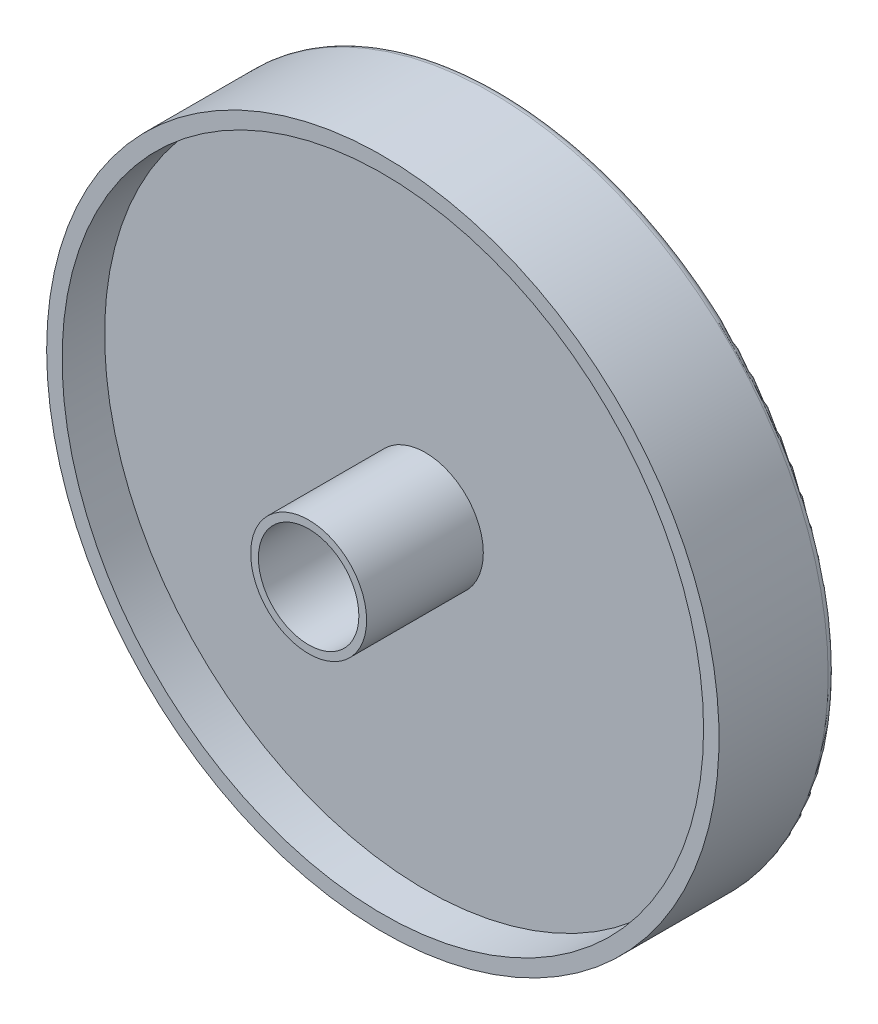
ISO-10303-21;
HEADER;
FILE_DESCRIPTION(('STEP AP214'),'2;1');
FILE_NAME('part.step','',(''),(''),'','','');
FILE_SCHEMA(('AUTOMOTIVE_DESIGN { 1 0 10303 214 1 1 1 1 }'));
ENDSEC;
DATA;
#1=APPLICATION_CONTEXT('core data for automotive mechanical design processes');
#2=APPLICATION_PROTOCOL_DEFINITION('international standard','automotive_design',2000,#1);
#3=PRODUCT_CONTEXT('',#1,'mechanical');
#4=PRODUCT('Part','Part','',(#3));
#5=PRODUCT_RELATED_PRODUCT_CATEGORY('part','',(#4));
#6=PRODUCT_DEFINITION_FORMATION('','',#4);
#7=PRODUCT_DEFINITION_CONTEXT('part definition',#1,'design');
#8=PRODUCT_DEFINITION('design','',#6,#7);
#9=PRODUCT_DEFINITION_SHAPE('','',#8);
#10=(LENGTH_UNIT() NAMED_UNIT(*) SI_UNIT(.MILLI.,.METRE.));
#11=(NAMED_UNIT(*) PLANE_ANGLE_UNIT() SI_UNIT($,.RADIAN.));
#12=(NAMED_UNIT(*) SI_UNIT($,.STERADIAN.) SOLID_ANGLE_UNIT());
#13=UNCERTAINTY_MEASURE_WITH_UNIT(LENGTH_MEASURE(1.E-05),#10,'distance_accuracy_value','');
#14=(GEOMETRIC_REPRESENTATION_CONTEXT(3) GLOBAL_UNCERTAINTY_ASSIGNED_CONTEXT((#13)) GLOBAL_UNIT_ASSIGNED_CONTEXT((#10,
#11,#12)) REPRESENTATION_CONTEXT('',''));
#15=CARTESIAN_POINT('',(0.,0.,0.));
#16=DIRECTION('',(0.,0.,1.));
#17=DIRECTION('',(1.,0.,0.));
#18=AXIS2_PLACEMENT_3D('',#15,#16,#17);
#19=CARTESIAN_POINT('',(0.,0.,0.));
#20=DIRECTION('',(0.,0.,1.));
#21=DIRECTION('',(1.,0.,0.));
#22=AXIS2_PLACEMENT_3D('',#19,#20,#21);
#23=PLANE('',#22);
#24=CARTESIAN_POINT('',(0.,0.,0.));
#25=DIRECTION('',(0.,0.,1.));
#26=DIRECTION('',(1.,0.,0.));
#27=AXIS2_PLACEMENT_3D('',#24,#25,#26);
#28=CIRCLE('',#27,41.5);
#29=CARTESIAN_POINT('',(41.5,0.,0.));
#30=VERTEX_POINT('',#29);
#31=EDGE_CURVE('E55',#30,#30,#28,.T.);
#32=ORIENTED_EDGE('',*,*,#31,.F.);
#33=EDGE_LOOP('',(#32));
#34=FACE_BOUND('',#33,.T.);
#35=CARTESIAN_POINT('',(0.,0.,0.));
#36=DIRECTION('',(0.,0.,-1.));
#37=DIRECTION('',(-1.,0.,0.));
#38=AXIS2_PLACEMENT_3D('',#35,#36,#37);
#39=CIRCLE('',#38,43.5);
#40=CARTESIAN_POINT('',(-43.5,0.,0.));
#41=VERTEX_POINT('',#40);
#42=EDGE_CURVE('E52',#41,#41,#39,.T.);
#43=ORIENTED_EDGE('',*,*,#42,.F.);
#44=EDGE_LOOP('',(#43));
#45=FACE_BOUND('',#44,.T.);
#46=ADVANCED_FACE('F32',(#34,#45),#23,.T.);
#47=CARTESIAN_POINT('',(0.,0.,-18.));
#48=DIRECTION('',(0.,0.,-1.));
#49=DIRECTION('',(-1.,0.,0.));
#50=AXIS2_PLACEMENT_3D('',#47,#48,#49);
#51=CYLINDRICAL_SURFACE('',#50,43.5);
#52=CARTESIAN_POINT('',(0.,0.,-14.1195440220866));
#53=DIRECTION('',(0.,0.,1.));
#54=DIRECTION('',(1.,0.,0.));
#55=AXIS2_PLACEMENT_3D('',#52,#53,#54);
#56=CIRCLE('',#55,43.5);
#57=CARTESIAN_POINT('',(43.5,0.,-14.1195440220866));
#58=VERTEX_POINT('',#57);
#59=EDGE_CURVE('E10',#58,#58,#56,.T.);
#60=ORIENTED_EDGE('',*,*,#59,.T.);
#61=EDGE_LOOP('',(#60));
#62=FACE_BOUND('',#61,.T.);
#63=ORIENTED_EDGE('',*,*,#42,.T.);
#64=EDGE_LOOP('',(#63));
#65=FACE_BOUND('',#64,.T.);
#66=ADVANCED_FACE('F162',(#62,#65),#51,.T.);
#67=CARTESIAN_POINT('',(0.,0.,-18.));
#68=DIRECTION('',(0.,0.,1.));
#69=DIRECTION('',(1.,0.,0.));
#70=AXIS2_PLACEMENT_3D('',#67,#68,#69);
#71=CONICAL_SURFACE('',#70,20.,1.44382353718082);
#72=CARTESIAN_POINT('',(0.,0.,-17.9919497796038));
#73=DIRECTION('',(0.,0.,-1.));
#74=DIRECTION('',(-1.,0.,0.));
#75=AXIS2_PLACEMENT_3D('',#72,#73,#74);
#76=CIRCLE('',#75,20.0630600597699);
#77=CARTESIAN_POINT('',(-20.0630600597699,0.,-17.9919497796038));
#78=VERTEX_POINT('',#77);
#79=EDGE_CURVE('E39',#78,#78,#76,.F.);
#80=ORIENTED_EDGE('',*,*,#79,.T.);
#81=EDGE_LOOP('',(#80));
#82=FACE_BOUND('',#81,.T.);
#83=CARTESIAN_POINT('',(0.,0.,-15.1114938016905));
#84=DIRECTION('',(0.,0.,-1.));
#85=DIRECTION('',(-1.,0.,0.));
#86=AXIS2_PLACEMENT_3D('',#83,#84,#85);
#87=CIRCLE('',#86,42.6266318867579);
#88=CARTESIAN_POINT('',(-42.6266318867579,0.,-15.1114938016905));
#89=VERTEX_POINT('',#88);
#90=EDGE_CURVE('E43',#89,#89,#87,.T.);
#91=ORIENTED_EDGE('',*,*,#90,.T.);
#92=EDGE_LOOP('',(#91));
#93=FACE_BOUND('',#92,.T.);
#94=ADVANCED_FACE('F168',(#82,#93),#71,.T.);
#95=CARTESIAN_POINT('',(-20.,0.,-18.));
#96=DIRECTION('',(0.,0.,-1.));
#97=DIRECTION('',(-1.,0.,0.));
#98=AXIS2_PLACEMENT_3D('',#95,#96,#97);
#99=PLANE('',#98);
#100=CARTESIAN_POINT('',(0.,0.,-18.));
#101=DIRECTION('',(0.,0.,-1.));
#102=DIRECTION('',(-1.,0.,0.));
#103=AXIS2_PLACEMENT_3D('',#100,#101,#102);
#104=CIRCLE('',#103,19.9364281730119);
#105=CARTESIAN_POINT('',(-19.9364281730119,0.,-18.));
#106=VERTEX_POINT('',#105);
#107=EDGE_CURVE('E47',#106,#106,#104,.T.);
#108=ORIENTED_EDGE('',*,*,#107,.T.);
#109=EDGE_LOOP('',(#108));
#110=FACE_BOUND('',#109,.T.);
#111=CARTESIAN_POINT('',(12.3743686707646,12.3743686707646,-18.));
#112=DIRECTION('',(0.,0.,-1.));
#113=DIRECTION('',(-1.,0.,0.));
#114=AXIS2_PLACEMENT_3D('',#111,#112,#113);
#115=CIRCLE('',#114,1.24999999999999);
#116=CARTESIAN_POINT('',(11.1243686707646,12.3743686707646,-18.));
#117=VERTEX_POINT('',#116);
#118=EDGE_CURVE('E100',#117,#117,#115,.T.);
#119=ORIENTED_EDGE('',*,*,#118,.F.);
#120=EDGE_LOOP('',(#119));
#121=FACE_BOUND('',#120,.T.);
#122=CARTESIAN_POINT('',(0.,17.5,-18.));
#123=DIRECTION('',(0.,0.,-1.));
#124=DIRECTION('',(-1.,0.,0.));
#125=AXIS2_PLACEMENT_3D('',#122,#123,#124);
#126=CIRCLE('',#125,1.24999999999999);
#127=CARTESIAN_POINT('',(-1.24999999999999,17.5,-18.));
#128=VERTEX_POINT('',#127);
#129=EDGE_CURVE('E97',#128,#128,#126,.T.);
#130=ORIENTED_EDGE('',*,*,#129,.F.);
#131=EDGE_LOOP('',(#130));
#132=FACE_BOUND('',#131,.T.);
#133=CARTESIAN_POINT('',(-12.3743686707646,12.3743686707645,-18.));
#134=DIRECTION('',(0.,0.,-1.));
#135=DIRECTION('',(-1.,0.,0.));
#136=AXIS2_PLACEMENT_3D('',#133,#134,#135);
#137=CIRCLE('',#136,1.24999999999999);
#138=CARTESIAN_POINT('',(-13.6243686707646,12.3743686707645,-18.));
#139=VERTEX_POINT('',#138);
#140=EDGE_CURVE('E94',#139,#139,#137,.T.);
#141=ORIENTED_EDGE('',*,*,#140,.F.);
#142=EDGE_LOOP('',(#141));
#143=FACE_BOUND('',#142,.T.);
#144=CARTESIAN_POINT('',(-17.5,0.,-18.));
#145=DIRECTION('',(0.,0.,-1.));
#146=DIRECTION('',(-1.,0.,0.));
#147=AXIS2_PLACEMENT_3D('',#144,#145,#146);
#148=CIRCLE('',#147,1.24999999999999);
#149=CARTESIAN_POINT('',(-18.75,0.,-18.));
#150=VERTEX_POINT('',#149);
#151=EDGE_CURVE('E91',#150,#150,#148,.T.);
#152=ORIENTED_EDGE('',*,*,#151,.F.);
#153=EDGE_LOOP('',(#152));
#154=FACE_BOUND('',#153,.T.);
#155=CARTESIAN_POINT('',(-12.3743686707646,-12.3743686707646,-18.));
#156=DIRECTION('',(0.,0.,-1.));
#157=DIRECTION('',(-1.,0.,0.));
#158=AXIS2_PLACEMENT_3D('',#155,#156,#157);
#159=CIRCLE('',#158,1.24999999999999);
#160=CARTESIAN_POINT('',(-13.6243686707645,-12.3743686707646,-18.));
#161=VERTEX_POINT('',#160);
#162=EDGE_CURVE('E88',#161,#161,#159,.T.);
#163=ORIENTED_EDGE('',*,*,#162,.F.);
#164=EDGE_LOOP('',(#163));
#165=FACE_BOUND('',#164,.T.);
#166=CARTESIAN_POINT('',(0.,-17.5,-18.));
#167=DIRECTION('',(0.,0.,-1.));
#168=DIRECTION('',(-1.,0.,0.));
#169=AXIS2_PLACEMENT_3D('',#166,#167,#168);
#170=CIRCLE('',#169,1.24999999999999);
#171=CARTESIAN_POINT('',(-1.24999999999999,-17.5,-18.));
#172=VERTEX_POINT('',#171);
#173=EDGE_CURVE('E85',#172,#172,#170,.T.);
#174=ORIENTED_EDGE('',*,*,#173,.F.);
#175=EDGE_LOOP('',(#174));
#176=FACE_BOUND('',#175,.T.);
#177=CARTESIAN_POINT('',(12.3743686707646,-12.3743686707646,-18.));
#178=DIRECTION('',(0.,0.,-1.));
#179=DIRECTION('',(-1.,0.,0.));
#180=AXIS2_PLACEMENT_3D('',#177,#178,#179);
#181=CIRCLE('',#180,1.24999999999999);
#182=CARTESIAN_POINT('',(11.1243686707646,-12.3743686707646,-18.));
#183=VERTEX_POINT('',#182);
#184=EDGE_CURVE('E82',#183,#183,#181,.T.);
#185=ORIENTED_EDGE('',*,*,#184,.F.);
#186=EDGE_LOOP('',(#185));
#187=FACE_BOUND('',#186,.T.);
#188=CARTESIAN_POINT('',(17.5,0.,-18.));
#189=DIRECTION('',(0.,0.,-1.));
#190=DIRECTION('',(-1.,0.,0.));
#191=AXIS2_PLACEMENT_3D('',#188,#189,#190);
#192=CIRCLE('',#191,1.24999999999999);
#193=CARTESIAN_POINT('',(16.25,0.,-18.));
#194=VERTEX_POINT('',#193);
#195=EDGE_CURVE('E79',#194,#194,#192,.T.);
#196=ORIENTED_EDGE('',*,*,#195,.F.);
#197=EDGE_LOOP('',(#196));
#198=FACE_BOUND('',#197,.T.);
#199=CARTESIAN_POINT('',(12.5,0.,-18.));
#200=DIRECTION('',(0.,0.,-1.));
#201=DIRECTION('',(-1.,0.,0.));
#202=AXIS2_PLACEMENT_3D('',#199,#200,#201);
#203=CIRCLE('',#202,1.24999999999999);
#204=CARTESIAN_POINT('',(11.25,0.,-18.));
#205=VERTEX_POINT('',#204);
#206=EDGE_CURVE('E76',#205,#205,#203,.T.);
#207=ORIENTED_EDGE('',*,*,#206,.F.);
#208=EDGE_LOOP('',(#207));
#209=FACE_BOUND('',#208,.T.);
#210=CARTESIAN_POINT('',(0.,12.5,-18.));
#211=DIRECTION('',(0.,0.,-1.));
#212=DIRECTION('',(-1.,0.,0.));
#213=AXIS2_PLACEMENT_3D('',#210,#211,#212);
#214=CIRCLE('',#213,1.24999999999999);
#215=CARTESIAN_POINT('',(-1.24999999999999,12.5,-18.));
#216=VERTEX_POINT('',#215);
#217=EDGE_CURVE('E73',#216,#216,#214,.T.);
#218=ORIENTED_EDGE('',*,*,#217,.F.);
#219=EDGE_LOOP('',(#218));
#220=FACE_BOUND('',#219,.T.);
#221=CARTESIAN_POINT('',(-12.5,0.,-18.));
#222=DIRECTION('',(0.,0.,-1.));
#223=DIRECTION('',(-1.,0.,0.));
#224=AXIS2_PLACEMENT_3D('',#221,#222,#223);
#225=CIRCLE('',#224,1.24999999999999);
#226=CARTESIAN_POINT('',(-13.75,0.,-18.));
#227=VERTEX_POINT('',#226);
#228=EDGE_CURVE('E70',#227,#227,#225,.T.);
#229=ORIENTED_EDGE('',*,*,#228,.F.);
#230=EDGE_LOOP('',(#229));
#231=FACE_BOUND('',#230,.T.);
#232=CARTESIAN_POINT('',(0.,-12.5,-18.));
#233=DIRECTION('',(0.,0.,-1.));
#234=DIRECTION('',(-1.,0.,0.));
#235=AXIS2_PLACEMENT_3D('',#232,#233,#234);
#236=CIRCLE('',#235,1.24999999999999);
#237=CARTESIAN_POINT('',(-1.24999999999999,-12.5,-18.));
#238=VERTEX_POINT('',#237);
#239=EDGE_CURVE('E67',#238,#238,#236,.T.);
#240=ORIENTED_EDGE('',*,*,#239,.F.);
#241=EDGE_LOOP('',(#240));
#242=FACE_BOUND('',#241,.T.);
#243=CARTESIAN_POINT('',(0.,0.,-18.));
#244=DIRECTION('',(0.,0.,-1.));
#245=DIRECTION('',(-1.,0.,0.));
#246=AXIS2_PLACEMENT_3D('',#243,#244,#245);
#247=CIRCLE('',#246,6.5);
#248=CARTESIAN_POINT('',(-6.5,0.,-18.));
#249=VERTEX_POINT('',#248);
#250=EDGE_CURVE('E58',#249,#249,#247,.T.);
#251=ORIENTED_EDGE('',*,*,#250,.F.);
#252=EDGE_LOOP('',(#251));
#253=FACE_BOUND('',#252,.T.);
#254=ADVANCED_FACE('F188',(#110,#121,#132,#143,#154,#165,#176,#187,#198,#209,#220,#231,#242,
#253),#99,.T.);
#255=CARTESIAN_POINT('',(0.,0.,-13.));
#256=DIRECTION('',(0.,0.,1.));
#257=DIRECTION('',(1.,0.,0.));
#258=AXIS2_PLACEMENT_3D('',#255,#256,#257);
#259=CYLINDRICAL_SURFACE('',#258,41.5);
#260=CARTESIAN_POINT('',(0.,0.,-5.5));
#261=DIRECTION('',(0.,0.,1.));
#262=DIRECTION('',(1.,0.,0.));
#263=AXIS2_PLACEMENT_3D('',#260,#261,#262);
#264=CIRCLE('',#263,41.5);
#265=CARTESIAN_POINT('',(41.5,0.,-5.5));
#266=VERTEX_POINT('',#265);
#267=EDGE_CURVE('E139',#266,#266,#264,.T.);
#268=CARTESIAN_POINT('',(41.5,0.,-5.5));
#269=CARTESIAN_POINT('',(41.5,0.,-5.44270833333333));
#270=CARTESIAN_POINT('',(41.5,0.,-5.38541666666667));
#271=CARTESIAN_POINT('',(41.5,0.,-5.27083333333333));
#272=CARTESIAN_POINT('',(41.5,0.,-5.21354166666667));
#273=CARTESIAN_POINT('',(41.5,0.,-5.09895833333333));
#274=CARTESIAN_POINT('',(41.5,0.,-5.04166666666667));
#275=CARTESIAN_POINT('',(41.5,0.,-4.92708333333333));
#276=CARTESIAN_POINT('',(41.5,0.,-4.86979166666667));
#277=CARTESIAN_POINT('',(41.5,0.,-4.75520833333333));
#278=CARTESIAN_POINT('',(41.5,0.,-4.69791666666667));
#279=CARTESIAN_POINT('',(41.5,0.,-4.58333333333333));
#280=CARTESIAN_POINT('',(41.5,0.,-4.52604166666667));
#281=CARTESIAN_POINT('',(41.5,0.,-4.41145833333333));
#282=CARTESIAN_POINT('',(41.5,0.,-4.35416666666667));
#283=CARTESIAN_POINT('',(41.5,0.,-4.23958333333333));
#284=CARTESIAN_POINT('',(41.5,0.,-4.18229166666667));
#285=CARTESIAN_POINT('',(41.5,0.,-4.06770833333333));
#286=CARTESIAN_POINT('',(41.5,0.,-4.01041666666667));
#287=CARTESIAN_POINT('',(41.5,0.,-3.89583333333333));
#288=CARTESIAN_POINT('',(41.5,0.,-3.83854166666667));
#289=CARTESIAN_POINT('',(41.5,0.,-3.72395833333333));
#290=CARTESIAN_POINT('',(41.5,0.,-3.66666666666667));
#291=CARTESIAN_POINT('',(41.5,0.,-3.55208333333333));
#292=CARTESIAN_POINT('',(41.5,0.,-3.49479166666667));
#293=CARTESIAN_POINT('',(41.5,0.,-3.38020833333333));
#294=CARTESIAN_POINT('',(41.5,0.,-3.32291666666667));
#295=CARTESIAN_POINT('',(41.5,0.,-3.20833333333333));
#296=CARTESIAN_POINT('',(41.5,0.,-3.15104166666667));
#297=CARTESIAN_POINT('',(41.5,0.,-3.03645833333333));
#298=CARTESIAN_POINT('',(41.5,0.,-2.97916666666667));
#299=CARTESIAN_POINT('',(41.5,0.,-2.86458333333333));
#300=CARTESIAN_POINT('',(41.5,0.,-2.80729166666667));
#301=CARTESIAN_POINT('',(41.5,0.,-2.69270833333333));
#302=CARTESIAN_POINT('',(41.5,0.,-2.63541666666667));
#303=CARTESIAN_POINT('',(41.5,0.,-2.52083333333333));
#304=CARTESIAN_POINT('',(41.5,0.,-2.46354166666667));
#305=CARTESIAN_POINT('',(41.5,0.,-2.34895833333333));
#306=CARTESIAN_POINT('',(41.5,0.,-2.29166666666667));
#307=CARTESIAN_POINT('',(41.5,0.,-2.17708333333333));
#308=CARTESIAN_POINT('',(41.5,0.,-2.11979166666667));
#309=CARTESIAN_POINT('',(41.5,0.,-2.00520833333333));
#310=CARTESIAN_POINT('',(41.5,0.,-1.94791666666667));
#311=CARTESIAN_POINT('',(41.5,0.,-1.83333333333333));
#312=CARTESIAN_POINT('',(41.5,0.,-1.77604166666667));
#313=CARTESIAN_POINT('',(41.5,0.,-1.66145833333333));
#314=CARTESIAN_POINT('',(41.5,0.,-1.60416666666667));
#315=CARTESIAN_POINT('',(41.5,0.,-1.48958333333333));
#316=CARTESIAN_POINT('',(41.5,0.,-1.43229166666667));
#317=CARTESIAN_POINT('',(41.5,0.,-1.31770833333333));
#318=CARTESIAN_POINT('',(41.5,0.,-1.26041666666667));
#319=CARTESIAN_POINT('',(41.5,0.,-1.14583333333333));
#320=CARTESIAN_POINT('',(41.5,0.,-1.08854166666667));
#321=CARTESIAN_POINT('',(41.5,0.,-0.973958333333334));
#322=CARTESIAN_POINT('',(41.5,0.,-0.916666666666666));
#323=CARTESIAN_POINT('',(41.5,0.,-0.802083333333333));
#324=CARTESIAN_POINT('',(41.5,0.,-0.744791666666667));
#325=CARTESIAN_POINT('',(41.5,0.,-0.630208333333334));
#326=CARTESIAN_POINT('',(41.5,0.,-0.572916666666667));
#327=CARTESIAN_POINT('',(41.5,0.,-0.458333333333334));
#328=CARTESIAN_POINT('',(41.5,0.,-0.401041666666667));
#329=CARTESIAN_POINT('',(41.5,0.,-0.286458333333334));
#330=CARTESIAN_POINT('',(41.5,0.,-0.229166666666667));
#331=CARTESIAN_POINT('',(41.5,0.,-0.114583333333333));
#332=CARTESIAN_POINT('',(41.5,0.,-0.0572916666666668));
#333=CARTESIAN_POINT('',(41.5,0.,0.));
#334=B_SPLINE_CURVE_WITH_KNOTS('',3,(#268,#269,#270,#271,#272,#273,#274,#275,#276,#277,#278,
#279,#280,#281,#282,#283,#284,#285,#286,#287,#288,#289,#290,#291,#292,#293,#294,#295,#296,#297,
#298,#299,#300,#301,#302,#303,#304,#305,#306,#307,#308,#309,#310,#311,#312,#313,#314,#315,#316,
#317,#318,#319,#320,#321,#322,#323,#324,#325,#326,#327,#328,#329,#330,#331,#332,#333),
.UNSPECIFIED.,.F.,.F.,(4,2,2,2,2,2,2,2,2,2,2,2,2,2,2,2,2,2,2,2,2,2,2,2,2,2,2,2,2,2,2,2,4),(0.,
0.171875,0.343749999999999,0.515625,0.6875,0.859375,1.03125,1.203125,1.375,1.546875,1.71875,
1.890625,2.0625,2.234375,2.40625,2.578125,2.75,2.921875,3.09375,3.265625,3.4375,3.609375,
3.78125,3.953125,4.125,4.296875,4.46875,4.640625,4.8125,4.984375,5.15625,5.328125,5.5),.UNSPECIFIED.);
#335=EDGE_CURVE('BSEAM191',#266,#30,#334,.T.);
#336=ORIENTED_EDGE('',*,*,#267,.F.);
#337=ORIENTED_EDGE('',*,*,#31,.T.);
#338=ORIENTED_EDGE('',*,*,#335,.T.);
#339=ORIENTED_EDGE('',*,*,#335,.F.);
#340=EDGE_LOOP('',(#336,#338,#337,#339));
#341=FACE_BOUND('',#340,.T.);
#342=ADVANCED_FACE('F191',(#341),#259,.F.);
#343=CARTESIAN_POINT('',(0.,0.,0.));
#344=DIRECTION('',(0.,0.,-1.));
#345=DIRECTION('',(-1.,0.,0.));
#346=AXIS2_PLACEMENT_3D('',#343,#344,#345);
#347=CYLINDRICAL_SURFACE('',#346,6.5);
#348=ORIENTED_EDGE('',*,*,#250,.T.);
#349=EDGE_LOOP('',(#348));
#350=FACE_BOUND('',#349,.T.);
#351=CARTESIAN_POINT('',(0.,0.,9.6));
#352=DIRECTION('',(0.,0.,1.));
#353=DIRECTION('',(1.,0.,0.));
#354=AXIS2_PLACEMENT_3D('',#351,#352,#353);
#355=CIRCLE('',#354,6.5);
#356=CARTESIAN_POINT('',(6.5,0.,9.6));
#357=VERTEX_POINT('',#356);
#358=EDGE_CURVE('E64',#357,#357,#355,.T.);
#359=ORIENTED_EDGE('',*,*,#358,.T.);
#360=EDGE_LOOP('',(#359));
#361=FACE_BOUND('',#360,.T.);
#362=ADVANCED_FACE('F219',(#350,#361),#347,.F.);
#363=CARTESIAN_POINT('',(0.,0.,9.6));
#364=DIRECTION('',(0.,0.,1.));
#365=DIRECTION('',(1.,0.,0.));
#366=AXIS2_PLACEMENT_3D('',#363,#364,#365);
#367=PLANE('',#366);
#368=CARTESIAN_POINT('',(0.,0.,9.6));
#369=DIRECTION('',(0.,0.,1.));
#370=DIRECTION('',(1.,0.,0.));
#371=AXIS2_PLACEMENT_3D('',#368,#369,#370);
#372=CIRCLE('',#371,7.5);
#373=CARTESIAN_POINT('',(7.5,0.,9.6));
#374=VERTEX_POINT('',#373);
#375=EDGE_CURVE('E61',#374,#374,#372,.T.);
#376=ORIENTED_EDGE('',*,*,#375,.T.);
#377=EDGE_LOOP('',(#376));
#378=FACE_BOUND('',#377,.T.);
#379=ORIENTED_EDGE('',*,*,#358,.F.);
#380=EDGE_LOOP('',(#379));
#381=FACE_BOUND('',#380,.T.);
#382=ADVANCED_FACE('F222',(#378,#381),#367,.T.);
#383=CARTESIAN_POINT('',(0.,0.,9.6));
#384=DIRECTION('',(0.,0.,-1.));
#385=DIRECTION('',(-1.,0.,0.));
#386=AXIS2_PLACEMENT_3D('',#383,#384,#385);
#387=CYLINDRICAL_SURFACE('',#386,7.5);
#388=CARTESIAN_POINT('',(0.,0.,-5.5));
#389=DIRECTION('',(0.,0.,1.));
#390=DIRECTION('',(1.,0.,0.));
#391=AXIS2_PLACEMENT_3D('',#388,#389,#390);
#392=CIRCLE('',#391,7.5);
#393=CARTESIAN_POINT('',(7.5,0.,-5.5));
#394=VERTEX_POINT('',#393);
#395=EDGE_CURVE('E142',#394,#394,#392,.T.);
#396=ORIENTED_EDGE('',*,*,#395,.T.);
#397=EDGE_LOOP('',(#396));
#398=FACE_BOUND('',#397,.T.);
#399=ORIENTED_EDGE('',*,*,#375,.F.);
#400=EDGE_LOOP('',(#399));
#401=FACE_BOUND('',#400,.T.);
#402=ADVANCED_FACE('F146',(#398,#401),#387,.T.);
#403=CARTESIAN_POINT('',(0.,-12.5,-18.));
#404=DIRECTION('',(0.,0.,-1.));
#405=DIRECTION('',(-1.,0.,0.));
#406=AXIS2_PLACEMENT_3D('',#403,#404,#405);
#407=CYLINDRICAL_SURFACE('',#406,1.24999999999999);
#408=CARTESIAN_POINT('',(0.,-12.5,-13.));
#409=DIRECTION('',(0.,0.,1.));
#410=DIRECTION('',(1.,0.,0.));
#411=AXIS2_PLACEMENT_3D('',#408,#409,#410);
#412=CIRCLE('',#411,1.24999999999999);
#413=CARTESIAN_POINT('',(1.24999999999999,-12.5,-13.));
#414=VERTEX_POINT('',#413);
#415=EDGE_CURVE('E103',#414,#414,#412,.F.);
#416=ORIENTED_EDGE('',*,*,#415,.F.);
#417=EDGE_LOOP('',(#416));
#418=FACE_BOUND('',#417,.T.);
#419=ORIENTED_EDGE('',*,*,#239,.T.);
#420=EDGE_LOOP('',(#419));
#421=FACE_BOUND('',#420,.T.);
#422=ADVANCED_FACE('F232',(#418,#421),#407,.F.);
#423=CARTESIAN_POINT('',(-12.5,0.,-18.));
#424=DIRECTION('',(0.,0.,-1.));
#425=DIRECTION('',(-1.,0.,0.));
#426=AXIS2_PLACEMENT_3D('',#423,#424,#425);
#427=CYLINDRICAL_SURFACE('',#426,1.24999999999999);
#428=CARTESIAN_POINT('',(-12.5,0.,-13.));
#429=DIRECTION('',(0.,0.,1.));
#430=DIRECTION('',(1.,0.,0.));
#431=AXIS2_PLACEMENT_3D('',#428,#429,#430);
#432=CIRCLE('',#431,1.24999999999999);
#433=CARTESIAN_POINT('',(-11.25,0.,-13.));
#434=VERTEX_POINT('',#433);
#435=EDGE_CURVE('E106',#434,#434,#432,.F.);
#436=ORIENTED_EDGE('',*,*,#435,.F.);
#437=EDGE_LOOP('',(#436));
#438=FACE_BOUND('',#437,.T.);
#439=ORIENTED_EDGE('',*,*,#228,.T.);
#440=EDGE_LOOP('',(#439));
#441=FACE_BOUND('',#440,.T.);
#442=ADVANCED_FACE('F279',(#438,#441),#427,.F.);
#443=CARTESIAN_POINT('',(0.,12.5,-18.));
#444=DIRECTION('',(0.,0.,-1.));
#445=DIRECTION('',(-1.,0.,0.));
#446=AXIS2_PLACEMENT_3D('',#443,#444,#445);
#447=CYLINDRICAL_SURFACE('',#446,1.24999999999999);
#448=CARTESIAN_POINT('',(0.,12.5,-13.));
#449=DIRECTION('',(0.,0.,1.));
#450=DIRECTION('',(1.,0.,0.));
#451=AXIS2_PLACEMENT_3D('',#448,#449,#450);
#452=CIRCLE('',#451,1.24999999999999);
#453=CARTESIAN_POINT('',(1.24999999999999,12.5,-13.));
#454=VERTEX_POINT('',#453);
#455=EDGE_CURVE('E109',#454,#454,#452,.F.);
#456=ORIENTED_EDGE('',*,*,#455,.F.);
#457=EDGE_LOOP('',(#456));
#458=FACE_BOUND('',#457,.T.);
#459=ORIENTED_EDGE('',*,*,#217,.T.);
#460=EDGE_LOOP('',(#459));
#461=FACE_BOUND('',#460,.T.);
#462=ADVANCED_FACE('F289',(#458,#461),#447,.F.);
#463=CARTESIAN_POINT('',(12.5,0.,-18.));
#464=DIRECTION('',(0.,0.,-1.));
#465=DIRECTION('',(-1.,0.,0.));
#466=AXIS2_PLACEMENT_3D('',#463,#464,#465);
#467=CYLINDRICAL_SURFACE('',#466,1.24999999999999);
#468=CARTESIAN_POINT('',(12.5,0.,-13.));
#469=DIRECTION('',(0.,0.,1.));
#470=DIRECTION('',(1.,0.,0.));
#471=AXIS2_PLACEMENT_3D('',#468,#469,#470);
#472=CIRCLE('',#471,1.24999999999999);
#473=CARTESIAN_POINT('',(13.75,0.,-13.));
#474=VERTEX_POINT('',#473);
#475=EDGE_CURVE('E112',#474,#474,#472,.F.);
#476=ORIENTED_EDGE('',*,*,#475,.F.);
#477=EDGE_LOOP('',(#476));
#478=FACE_BOUND('',#477,.T.);
#479=ORIENTED_EDGE('',*,*,#206,.T.);
#480=EDGE_LOOP('',(#479));
#481=FACE_BOUND('',#480,.T.);
#482=ADVANCED_FACE('F299',(#478,#481),#467,.F.);
#483=CARTESIAN_POINT('',(17.5,0.,-18.));
#484=DIRECTION('',(0.,0.,-1.));
#485=DIRECTION('',(-1.,0.,0.));
#486=AXIS2_PLACEMENT_3D('',#483,#484,#485);
#487=CYLINDRICAL_SURFACE('',#486,1.24999999999999);
#488=CARTESIAN_POINT('',(17.5,0.,-13.));
#489=DIRECTION('',(0.,0.,1.));
#490=DIRECTION('',(1.,0.,0.));
#491=AXIS2_PLACEMENT_3D('',#488,#489,#490);
#492=CIRCLE('',#491,1.24999999999999);
#493=CARTESIAN_POINT('',(18.75,0.,-13.));
#494=VERTEX_POINT('',#493);
#495=EDGE_CURVE('E115',#494,#494,#492,.F.);
#496=ORIENTED_EDGE('',*,*,#495,.F.);
#497=EDGE_LOOP('',(#496));
#498=FACE_BOUND('',#497,.T.);
#499=ORIENTED_EDGE('',*,*,#195,.T.);
#500=EDGE_LOOP('',(#499));
#501=FACE_BOUND('',#500,.T.);
#502=ADVANCED_FACE('F310',(#498,#501),#487,.F.);
#503=CARTESIAN_POINT('',(12.3743686707646,-12.3743686707646,-18.));
#504=DIRECTION('',(0.,0.,-1.));
#505=DIRECTION('',(-1.,0.,0.));
#506=AXIS2_PLACEMENT_3D('',#503,#504,#505);
#507=CYLINDRICAL_SURFACE('',#506,1.24999999999999);
#508=CARTESIAN_POINT('',(12.3743686707646,-12.3743686707646,-13.));
#509=DIRECTION('',(0.,0.,1.));
#510=DIRECTION('',(1.,0.,0.));
#511=AXIS2_PLACEMENT_3D('',#508,#509,#510);
#512=CIRCLE('',#511,1.24999999999999);
#513=CARTESIAN_POINT('',(13.6243686707646,-12.3743686707646,-13.));
#514=VERTEX_POINT('',#513);
#515=EDGE_CURVE('E118',#514,#514,#512,.F.);
#516=ORIENTED_EDGE('',*,*,#515,.F.);
#517=EDGE_LOOP('',(#516));
#518=FACE_BOUND('',#517,.T.);
#519=ORIENTED_EDGE('',*,*,#184,.T.);
#520=EDGE_LOOP('',(#519));
#521=FACE_BOUND('',#520,.T.);
#522=ADVANCED_FACE('F321',(#518,#521),#507,.F.);
#523=CARTESIAN_POINT('',(0.,-17.5,-18.));
#524=DIRECTION('',(0.,0.,-1.));
#525=DIRECTION('',(-1.,0.,0.));
#526=AXIS2_PLACEMENT_3D('',#523,#524,#525);
#527=CYLINDRICAL_SURFACE('',#526,1.24999999999999);
#528=CARTESIAN_POINT('',(0.,-17.5,-13.));
#529=DIRECTION('',(0.,0.,1.));
#530=DIRECTION('',(1.,0.,0.));
#531=AXIS2_PLACEMENT_3D('',#528,#529,#530);
#532=CIRCLE('',#531,1.24999999999999);
#533=CARTESIAN_POINT('',(1.24999999999999,-17.5,-13.));
#534=VERTEX_POINT('',#533);
#535=EDGE_CURVE('E121',#534,#534,#532,.F.);
#536=ORIENTED_EDGE('',*,*,#535,.F.);
#537=EDGE_LOOP('',(#536));
#538=FACE_BOUND('',#537,.T.);
#539=ORIENTED_EDGE('',*,*,#173,.T.);
#540=EDGE_LOOP('',(#539));
#541=FACE_BOUND('',#540,.T.);
#542=ADVANCED_FACE('F332',(#538,#541),#527,.F.);
#543=CARTESIAN_POINT('',(-12.3743686707646,-12.3743686707646,-18.));
#544=DIRECTION('',(0.,0.,-1.));
#545=DIRECTION('',(-1.,0.,0.));
#546=AXIS2_PLACEMENT_3D('',#543,#544,#545);
#547=CYLINDRICAL_SURFACE('',#546,1.24999999999999);
#548=CARTESIAN_POINT('',(-12.3743686707646,-12.3743686707646,-13.));
#549=DIRECTION('',(0.,0.,1.));
#550=DIRECTION('',(1.,0.,0.));
#551=AXIS2_PLACEMENT_3D('',#548,#549,#550);
#552=CIRCLE('',#551,1.24999999999999);
#553=CARTESIAN_POINT('',(-11.1243686707646,-12.3743686707646,-13.));
#554=VERTEX_POINT('',#553);
#555=EDGE_CURVE('E124',#554,#554,#552,.F.);
#556=ORIENTED_EDGE('',*,*,#555,.F.);
#557=EDGE_LOOP('',(#556));
#558=FACE_BOUND('',#557,.T.);
#559=ORIENTED_EDGE('',*,*,#162,.T.);
#560=EDGE_LOOP('',(#559));
#561=FACE_BOUND('',#560,.T.);
#562=ADVANCED_FACE('F343',(#558,#561),#547,.F.);
#563=CARTESIAN_POINT('',(-17.5,0.,-18.));
#564=DIRECTION('',(0.,0.,-1.));
#565=DIRECTION('',(-1.,0.,0.));
#566=AXIS2_PLACEMENT_3D('',#563,#564,#565);
#567=CYLINDRICAL_SURFACE('',#566,1.24999999999999);
#568=CARTESIAN_POINT('',(-17.5,0.,-13.));
#569=DIRECTION('',(0.,0.,1.));
#570=DIRECTION('',(1.,0.,0.));
#571=AXIS2_PLACEMENT_3D('',#568,#569,#570);
#572=CIRCLE('',#571,1.24999999999999);
#573=CARTESIAN_POINT('',(-16.25,0.,-13.));
#574=VERTEX_POINT('',#573);
#575=EDGE_CURVE('E127',#574,#574,#572,.F.);
#576=ORIENTED_EDGE('',*,*,#575,.F.);
#577=EDGE_LOOP('',(#576));
#578=FACE_BOUND('',#577,.T.);
#579=ORIENTED_EDGE('',*,*,#151,.T.);
#580=EDGE_LOOP('',(#579));
#581=FACE_BOUND('',#580,.T.);
#582=ADVANCED_FACE('F354',(#578,#581),#567,.F.);
#583=CARTESIAN_POINT('',(-12.3743686707646,12.3743686707645,-18.));
#584=DIRECTION('',(0.,0.,-1.));
#585=DIRECTION('',(-1.,0.,0.));
#586=AXIS2_PLACEMENT_3D('',#583,#584,#585);
#587=CYLINDRICAL_SURFACE('',#586,1.24999999999999);
#588=CARTESIAN_POINT('',(-12.3743686707646,12.3743686707645,-13.));
#589=DIRECTION('',(0.,0.,1.));
#590=DIRECTION('',(1.,0.,0.));
#591=AXIS2_PLACEMENT_3D('',#588,#589,#590);
#592=CIRCLE('',#591,1.24999999999999);
#593=CARTESIAN_POINT('',(-11.1243686707647,12.3743686707645,-13.));
#594=VERTEX_POINT('',#593);
#595=EDGE_CURVE('E130',#594,#594,#592,.F.);
#596=ORIENTED_EDGE('',*,*,#595,.F.);
#597=EDGE_LOOP('',(#596));
#598=FACE_BOUND('',#597,.T.);
#599=ORIENTED_EDGE('',*,*,#140,.T.);
#600=EDGE_LOOP('',(#599));
#601=FACE_BOUND('',#600,.T.);
#602=ADVANCED_FACE('F365',(#598,#601),#587,.F.);
#603=CARTESIAN_POINT('',(0.,17.5,-18.));
#604=DIRECTION('',(0.,0.,-1.));
#605=DIRECTION('',(-1.,0.,0.));
#606=AXIS2_PLACEMENT_3D('',#603,#604,#605);
#607=CYLINDRICAL_SURFACE('',#606,1.24999999999999);
#608=CARTESIAN_POINT('',(0.,17.5,-13.));
#609=DIRECTION('',(0.,0.,1.));
#610=DIRECTION('',(1.,0.,0.));
#611=AXIS2_PLACEMENT_3D('',#608,#609,#610);
#612=CIRCLE('',#611,1.24999999999999);
#613=CARTESIAN_POINT('',(1.24999999999999,17.5,-13.));
#614=VERTEX_POINT('',#613);
#615=EDGE_CURVE('E133',#614,#614,#612,.F.);
#616=ORIENTED_EDGE('',*,*,#615,.F.);
#617=EDGE_LOOP('',(#616));
#618=FACE_BOUND('',#617,.T.);
#619=ORIENTED_EDGE('',*,*,#129,.T.);
#620=EDGE_LOOP('',(#619));
#621=FACE_BOUND('',#620,.T.);
#622=ADVANCED_FACE('F182',(#618,#621),#607,.F.);
#623=CARTESIAN_POINT('',(12.3743686707646,12.3743686707646,-18.));
#624=DIRECTION('',(0.,0.,-1.));
#625=DIRECTION('',(-1.,0.,0.));
#626=AXIS2_PLACEMENT_3D('',#623,#624,#625);
#627=CYLINDRICAL_SURFACE('',#626,1.24999999999999);
#628=CARTESIAN_POINT('',(12.3743686707646,12.3743686707646,-13.));
#629=DIRECTION('',(0.,0.,1.));
#630=DIRECTION('',(1.,0.,0.));
#631=AXIS2_PLACEMENT_3D('',#628,#629,#630);
#632=CIRCLE('',#631,1.24999999999999);
#633=CARTESIAN_POINT('',(13.6243686707646,12.3743686707646,-13.));
#634=VERTEX_POINT('',#633);
#635=EDGE_CURVE('E136',#634,#634,#632,.F.);
#636=ORIENTED_EDGE('',*,*,#635,.F.);
#637=EDGE_LOOP('',(#636));
#638=FACE_BOUND('',#637,.T.);
#639=ORIENTED_EDGE('',*,*,#118,.T.);
#640=EDGE_LOOP('',(#639));
#641=FACE_BOUND('',#640,.T.);
#642=ADVANCED_FACE('F175',(#638,#641),#627,.F.);
#643=CARTESIAN_POINT('',(0.,0.,-17.));
#644=DIRECTION('',(0.,0.,-1.));
#645=DIRECTION('',(-1.,0.,0.));
#646=AXIS2_PLACEMENT_3D('',#643,#644,#645);
#647=TOROIDAL_SURFACE('',#646,19.9364281730119,1.);
#648=ORIENTED_EDGE('',*,*,#79,.F.);
#649=EDGE_LOOP('',(#648));
#650=FACE_BOUND('',#649,.T.);
#651=ORIENTED_EDGE('',*,*,#107,.F.);
#652=EDGE_LOOP('',(#651));
#653=FACE_BOUND('',#652,.T.);
#654=ADVANCED_FACE('F173',(#650,#653),#647,.T.);
#655=CARTESIAN_POINT('',(0.,0.,-14.1195440220866));
#656=DIRECTION('',(0.,0.,1.));
#657=DIRECTION('',(1.,0.,0.));
#658=AXIS2_PLACEMENT_3D('',#655,#656,#657);
#659=TOROIDAL_SURFACE('',#658,42.5,1.);
#660=ORIENTED_EDGE('',*,*,#59,.F.);
#661=EDGE_LOOP('',(#660));
#662=FACE_BOUND('',#661,.T.);
#663=ORIENTED_EDGE('',*,*,#90,.F.);
#664=EDGE_LOOP('',(#663));
#665=FACE_BOUND('',#664,.T.);
#666=ADVANCED_FACE('F34',(#662,#665),#659,.T.);
#667=CARTESIAN_POINT('',(0.,0.,-13.));
#668=DIRECTION('',(0.,0.,1.));
#669=DIRECTION('',(1.,0.,0.));
#670=AXIS2_PLACEMENT_3D('',#667,#668,#669);
#671=PLANE('',#670);
#672=ORIENTED_EDGE('',*,*,#635,.T.);
#673=EDGE_LOOP('',(#672));
#674=FACE_BOUND('',#673,.T.);
#675=ADVANCED_FACE('F160',(#674),#671,.F.);
#676=ORIENTED_EDGE('',*,*,#615,.T.);
#677=EDGE_LOOP('',(#676));
#678=FACE_BOUND('',#677,.T.);
#679=ADVANCED_FACE('F433',(#678),#671,.F.);
#680=ORIENTED_EDGE('',*,*,#595,.T.);
#681=EDGE_LOOP('',(#680));
#682=FACE_BOUND('',#681,.T.);
#683=ADVANCED_FACE('F443',(#682),#671,.F.);
#684=ORIENTED_EDGE('',*,*,#575,.T.);
#685=EDGE_LOOP('',(#684));
#686=FACE_BOUND('',#685,.T.);
#687=ADVANCED_FACE('F452',(#686),#671,.F.);
#688=ORIENTED_EDGE('',*,*,#555,.T.);
#689=EDGE_LOOP('',(#688));
#690=FACE_BOUND('',#689,.T.);
#691=ADVANCED_FACE('F461',(#690),#671,.F.);
#692=ORIENTED_EDGE('',*,*,#535,.T.);
#693=EDGE_LOOP('',(#692));
#694=FACE_BOUND('',#693,.T.);
#695=ADVANCED_FACE('F470',(#694),#671,.F.);
#696=ORIENTED_EDGE('',*,*,#515,.T.);
#697=EDGE_LOOP('',(#696));
#698=FACE_BOUND('',#697,.T.);
#699=ADVANCED_FACE('F479',(#698),#671,.F.);
#700=ORIENTED_EDGE('',*,*,#495,.T.);
#701=EDGE_LOOP('',(#700));
#702=FACE_BOUND('',#701,.T.);
#703=ADVANCED_FACE('F488',(#702),#671,.F.);
#704=ORIENTED_EDGE('',*,*,#475,.T.);
#705=EDGE_LOOP('',(#704));
#706=FACE_BOUND('',#705,.T.);
#707=ADVANCED_FACE('F497',(#706),#671,.F.);
#708=ORIENTED_EDGE('',*,*,#455,.T.);
#709=EDGE_LOOP('',(#708));
#710=FACE_BOUND('',#709,.T.);
#711=ADVANCED_FACE('F506',(#710),#671,.F.);
#712=ORIENTED_EDGE('',*,*,#435,.T.);
#713=EDGE_LOOP('',(#712));
#714=FACE_BOUND('',#713,.T.);
#715=ADVANCED_FACE('F157',(#714),#671,.F.);
#716=ORIENTED_EDGE('',*,*,#415,.T.);
#717=EDGE_LOOP('',(#716));
#718=FACE_BOUND('',#717,.T.);
#719=ADVANCED_FACE('F151',(#718),#671,.F.);
#720=CARTESIAN_POINT('',(0.,0.,-5.5));
#721=DIRECTION('',(0.,0.,1.));
#722=DIRECTION('',(1.,0.,0.));
#723=AXIS2_PLACEMENT_3D('',#720,#721,#722);
#724=PLANE('',#723);
#725=ORIENTED_EDGE('',*,*,#267,.T.);
#726=EDGE_LOOP('',(#725));
#727=FACE_BOUND('',#726,.T.);
#728=ORIENTED_EDGE('',*,*,#395,.F.);
#729=EDGE_LOOP('',(#728));
#730=FACE_BOUND('',#729,.T.);
#731=ADVANCED_FACE('F149',(#727,#730),#724,.T.);
#732=CLOSED_SHELL('',(#46,#66,#94,#254,#342,#362,#382,#402,#422,#442,#462,#482,#502,#522,#542,
#562,#582,#602,#622,#642,#654,#666,#675,#679,#683,#687,#691,#695,#699,#703,#707,#711,#715,#719,#731));
#733=MANIFOLD_SOLID_BREP('B2',#732);
#734=ADVANCED_BREP_SHAPE_REPRESENTATION('',(#18,#733),#14);
#735=SHAPE_DEFINITION_REPRESENTATION(#9,#734);
ENDSEC;
END-ISO-10303-21;
